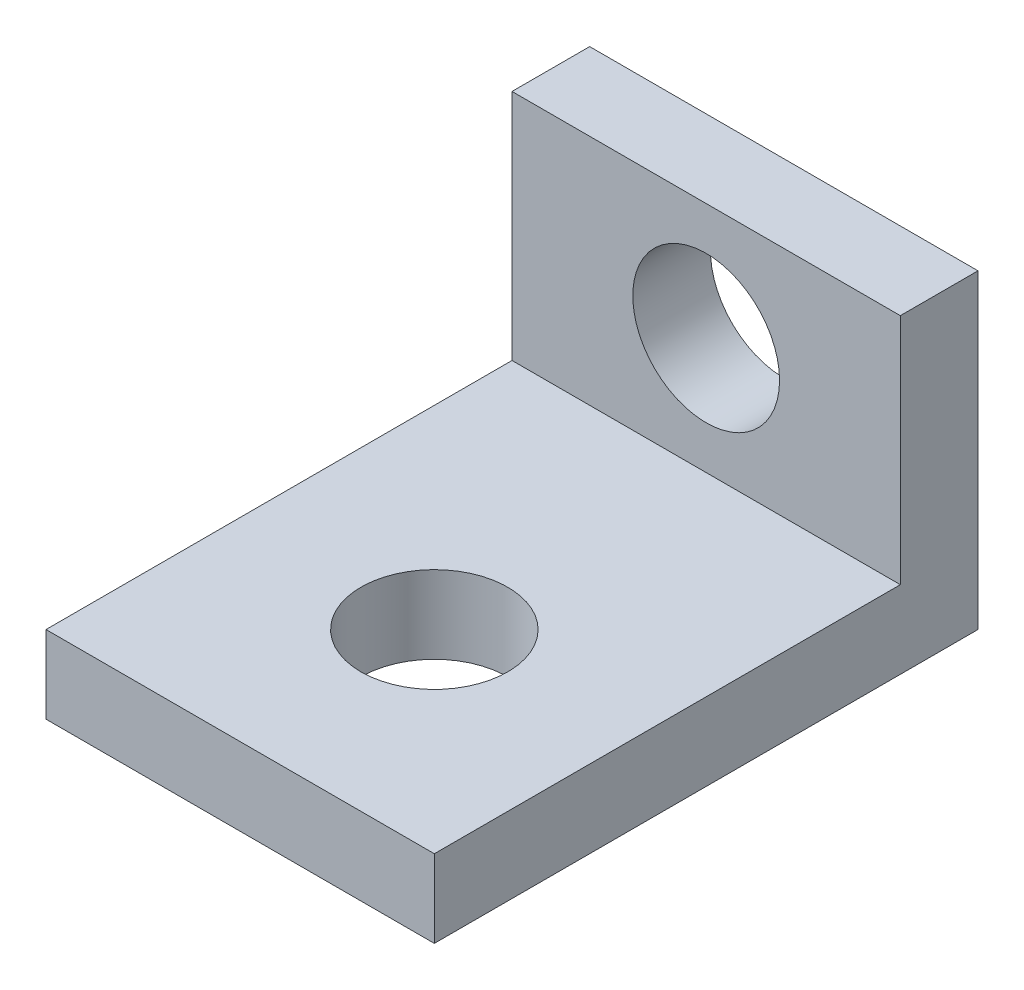
ISO-10303-21;
HEADER;
FILE_DESCRIPTION(('STEP AP214'),'2;1');
FILE_NAME('part.step','',(''),(''),'','','');
FILE_SCHEMA(('AUTOMOTIVE_DESIGN { 1 0 10303 214 1 1 1 1 }'));
ENDSEC;
DATA;
#1=APPLICATION_CONTEXT('core data for automotive mechanical design processes');
#2=APPLICATION_PROTOCOL_DEFINITION('international standard','automotive_design',2000,#1);
#3=PRODUCT_CONTEXT('',#1,'mechanical');
#4=PRODUCT('Part','Part','',(#3));
#5=PRODUCT_RELATED_PRODUCT_CATEGORY('part','',(#4));
#6=PRODUCT_DEFINITION_FORMATION('','',#4);
#7=PRODUCT_DEFINITION_CONTEXT('part definition',#1,'design');
#8=PRODUCT_DEFINITION('design','',#6,#7);
#9=PRODUCT_DEFINITION_SHAPE('','',#8);
#10=(LENGTH_UNIT() NAMED_UNIT(*) SI_UNIT(.MILLI.,.METRE.));
#11=(NAMED_UNIT(*) PLANE_ANGLE_UNIT() SI_UNIT($,.RADIAN.));
#12=(NAMED_UNIT(*) SI_UNIT($,.STERADIAN.) SOLID_ANGLE_UNIT());
#13=UNCERTAINTY_MEASURE_WITH_UNIT(LENGTH_MEASURE(1.E-05),#10,'distance_accuracy_value','');
#14=(GEOMETRIC_REPRESENTATION_CONTEXT(3) GLOBAL_UNCERTAINTY_ASSIGNED_CONTEXT((#13)) GLOBAL_UNIT_ASSIGNED_CONTEXT((#10,
#11,#12)) REPRESENTATION_CONTEXT('',''));
#15=CARTESIAN_POINT('',(0.,0.,0.));
#16=DIRECTION('',(0.,0.,1.));
#17=DIRECTION('',(1.,0.,0.));
#18=AXIS2_PLACEMENT_3D('',#15,#16,#17);
#19=CARTESIAN_POINT('',(-10.776307345283,2.54,0.));
#20=DIRECTION('',(0.,-1.,0.));
#21=DIRECTION('',(0.,0.,-1.));
#22=AXIS2_PLACEMENT_3D('',#19,#20,#21);
#23=PLANE('',#22);
#24=DIRECTION('',(-1.,0.,0.));
#25=VECTOR('',#24,1.);
#26=CARTESIAN_POINT('',(0.,2.54,7.62));
#27=LINE('',#26,#25);
#28=CARTESIAN_POINT('',(12.7,2.54,7.62));
#29=VERTEX_POINT('',#28);
#30=CARTESIAN_POINT('',(0.,2.54,7.62));
#31=VERTEX_POINT('',#30);
#32=EDGE_CURVE('E104',#29,#31,#27,.T.);
#33=ORIENTED_EDGE('',*,*,#32,.F.);
#34=DIRECTION('',(0.,0.,-1.));
#35=VECTOR('',#34,1.);
#36=CARTESIAN_POINT('',(12.7,2.54,0.));
#37=LINE('',#36,#35);
#38=CARTESIAN_POINT('',(12.7,2.54,-7.62));
#39=VERTEX_POINT('',#38);
#40=EDGE_CURVE('E48',#29,#39,#37,.T.);
#41=ORIENTED_EDGE('',*,*,#40,.T.);
#42=DIRECTION('',(1.,0.,0.));
#43=VECTOR('',#42,1.);
#44=CARTESIAN_POINT('',(-10.776307345283,2.54,-7.62));
#45=LINE('',#44,#43);
#46=CARTESIAN_POINT('',(0.,2.54,-7.62));
#47=VERTEX_POINT('',#46);
#48=EDGE_CURVE('E120',#47,#39,#45,.T.);
#49=ORIENTED_EDGE('',*,*,#48,.F.);
#50=DIRECTION('',(0.,0.,-1.));
#51=VECTOR('',#50,1.);
#52=CARTESIAN_POINT('',(0.,2.54,0.));
#53=LINE('',#52,#51);
#54=EDGE_CURVE('E117',#31,#47,#53,.T.);
#55=ORIENTED_EDGE('',*,*,#54,.F.);
#56=EDGE_LOOP('',(#33,#41,#49,#55));
#57=FACE_BOUND('',#56,.T.);
#58=CARTESIAN_POINT('',(6.35,2.54,1.27));
#59=DIRECTION('',(0.,1.,0.));
#60=DIRECTION('',(0.,0.,1.));
#61=AXIS2_PLACEMENT_3D('',#58,#59,#60);
#62=CIRCLE('',#61,2.39999999999999);
#63=CARTESIAN_POINT('',(6.35,2.54,3.66999999999999));
#64=VERTEX_POINT('',#63);
#65=EDGE_CURVE('E149',#64,#64,#62,.T.);
#66=ORIENTED_EDGE('',*,*,#65,.F.);
#67=EDGE_LOOP('',(#66));
#68=FACE_BOUND('',#67,.T.);
#69=ADVANCED_FACE('F33',(#57,#68),#23,.F.);
#70=CARTESIAN_POINT('',(-10.776307345283,10.16,-7.62));
#71=DIRECTION('',(0.,0.,-1.));
#72=DIRECTION('',(-1.,0.,0.));
#73=AXIS2_PLACEMENT_3D('',#70,#71,#72);
#74=PLANE('',#73);
#75=ORIENTED_EDGE('',*,*,#48,.T.);
#76=DIRECTION('',(0.,1.,0.));
#77=VECTOR('',#76,1.);
#78=CARTESIAN_POINT('',(12.7,10.16,-7.62));
#79=LINE('',#78,#77);
#80=CARTESIAN_POINT('',(12.7,10.16,-7.62));
#81=VERTEX_POINT('',#80);
#82=EDGE_CURVE('E150',#39,#81,#79,.T.);
#83=ORIENTED_EDGE('',*,*,#82,.T.);
#84=DIRECTION('',(1.,0.,0.));
#85=VECTOR('',#84,1.);
#86=CARTESIAN_POINT('',(-10.776307345283,10.16,-7.62));
#87=LINE('',#86,#85);
#88=CARTESIAN_POINT('',(0.,10.16,-7.62));
#89=VERTEX_POINT('',#88);
#90=EDGE_CURVE('E56',#89,#81,#87,.T.);
#91=ORIENTED_EDGE('',*,*,#90,.F.);
#92=DIRECTION('',(0.,1.,0.));
#93=VECTOR('',#92,1.);
#94=CARTESIAN_POINT('',(0.,10.16,-7.62));
#95=LINE('',#94,#93);
#96=EDGE_CURVE('E121',#47,#89,#95,.T.);
#97=ORIENTED_EDGE('',*,*,#96,.F.);
#98=EDGE_LOOP('',(#75,#83,#91,#97));
#99=FACE_BOUND('',#98,.T.);
#100=CARTESIAN_POINT('',(6.35,6.35,-7.62));
#101=DIRECTION('',(0.,0.,1.));
#102=DIRECTION('',(1.,0.,0.));
#103=AXIS2_PLACEMENT_3D('',#100,#101,#102);
#104=CIRCLE('',#103,2.39999999999999);
#105=CARTESIAN_POINT('',(8.74999999999999,6.35,-7.62));
#106=VERTEX_POINT('',#105);
#107=EDGE_CURVE('E106',#106,#106,#104,.T.);
#108=ORIENTED_EDGE('',*,*,#107,.F.);
#109=EDGE_LOOP('',(#108));
#110=FACE_BOUND('',#109,.T.);
#111=ADVANCED_FACE('F145',(#99,#110),#74,.F.);
#112=CARTESIAN_POINT('',(38.1,0.,0.));
#113=DIRECTION('',(0.,1.,0.));
#114=DIRECTION('',(0.,0.,1.));
#115=AXIS2_PLACEMENT_3D('',#112,#113,#114);
#116=PLANE('',#115);
#117=CARTESIAN_POINT('',(6.35,0.,1.27));
#118=DIRECTION('',(0.,1.,0.));
#119=DIRECTION('',(0.,0.,1.));
#120=AXIS2_PLACEMENT_3D('',#117,#118,#119);
#121=CIRCLE('',#120,2.4);
#122=CARTESIAN_POINT('',(6.35,0.,3.67));
#123=VERTEX_POINT('',#122);
#124=EDGE_CURVE('E108',#123,#123,#121,.T.);
#125=ORIENTED_EDGE('',*,*,#124,.T.);
#126=EDGE_LOOP('',(#125));
#127=FACE_BOUND('',#126,.T.);
#128=DIRECTION('',(-1.,0.,0.));
#129=VECTOR('',#128,1.);
#130=CARTESIAN_POINT('',(38.1,0.,-10.16));
#131=LINE('',#130,#129);
#132=CARTESIAN_POINT('',(12.7,0.,-10.16));
#133=VERTEX_POINT('',#132);
#134=CARTESIAN_POINT('',(0.,0.,-10.16));
#135=VERTEX_POINT('',#134);
#136=EDGE_CURVE('E11',#133,#135,#131,.T.);
#137=ORIENTED_EDGE('',*,*,#136,.F.);
#138=DIRECTION('',(0.,0.,-1.));
#139=VECTOR('',#138,1.);
#140=CARTESIAN_POINT('',(12.7,0.,34.9766372202433));
#141=LINE('',#140,#139);
#142=CARTESIAN_POINT('',(12.7,0.,7.62));
#143=VERTEX_POINT('',#142);
#144=EDGE_CURVE('E86',#143,#133,#141,.T.);
#145=ORIENTED_EDGE('',*,*,#144,.F.);
#146=DIRECTION('',(1.,0.,0.));
#147=VECTOR('',#146,1.);
#148=CARTESIAN_POINT('',(0.,0.,7.62));
#149=LINE('',#148,#147);
#150=CARTESIAN_POINT('',(0.,0.,7.62));
#151=VERTEX_POINT('',#150);
#152=EDGE_CURVE('E97',#151,#143,#149,.T.);
#153=ORIENTED_EDGE('',*,*,#152,.F.);
#154=DIRECTION('',(0.,0.,-1.));
#155=VECTOR('',#154,1.);
#156=CARTESIAN_POINT('',(0.,0.,0.));
#157=LINE('',#156,#155);
#158=EDGE_CURVE('E124',#151,#135,#157,.T.);
#159=ORIENTED_EDGE('',*,*,#158,.T.);
#160=EDGE_LOOP('',(#137,#145,#153,#159));
#161=FACE_BOUND('',#160,.T.);
#162=ADVANCED_FACE('F35',(#127,#161),#116,.F.);
#163=CARTESIAN_POINT('',(38.1,0.,-10.16));
#164=DIRECTION('',(0.,0.,1.));
#165=DIRECTION('',(1.,0.,0.));
#166=AXIS2_PLACEMENT_3D('',#163,#164,#165);
#167=PLANE('',#166);
#168=CARTESIAN_POINT('',(6.35,6.35,-10.16));
#169=DIRECTION('',(0.,0.,1.));
#170=DIRECTION('',(1.,0.,0.));
#171=AXIS2_PLACEMENT_3D('',#168,#169,#170);
#172=CIRCLE('',#171,2.4);
#173=CARTESIAN_POINT('',(8.75,6.35,-10.16));
#174=VERTEX_POINT('',#173);
#175=EDGE_CURVE('E114',#174,#174,#172,.T.);
#176=ORIENTED_EDGE('',*,*,#175,.T.);
#177=EDGE_LOOP('',(#176));
#178=FACE_BOUND('',#177,.T.);
#179=DIRECTION('',(-1.,0.,0.));
#180=VECTOR('',#179,1.);
#181=CARTESIAN_POINT('',(38.1,10.16,-10.16));
#182=LINE('',#181,#180);
#183=CARTESIAN_POINT('',(12.7,10.16,-10.16));
#184=VERTEX_POINT('',#183);
#185=CARTESIAN_POINT('',(0.,10.16,-10.16));
#186=VERTEX_POINT('',#185);
#187=EDGE_CURVE('E41',#184,#186,#182,.T.);
#188=ORIENTED_EDGE('',*,*,#187,.F.);
#189=DIRECTION('',(0.,1.,0.));
#190=VECTOR('',#189,1.);
#191=CARTESIAN_POINT('',(12.7,10.16,-10.16));
#192=LINE('',#191,#190);
#193=EDGE_CURVE('E99',#133,#184,#192,.T.);
#194=ORIENTED_EDGE('',*,*,#193,.F.);
#195=ORIENTED_EDGE('',*,*,#136,.T.);
#196=DIRECTION('',(0.,1.,0.));
#197=VECTOR('',#196,1.);
#198=CARTESIAN_POINT('',(0.,0.,-10.16));
#199=LINE('',#198,#197);
#200=EDGE_CURVE('E128',#135,#186,#199,.T.);
#201=ORIENTED_EDGE('',*,*,#200,.T.);
#202=EDGE_LOOP('',(#188,#194,#195,#201));
#203=FACE_BOUND('',#202,.T.);
#204=ADVANCED_FACE('F140',(#178,#203),#167,.F.);
#205=CARTESIAN_POINT('',(38.1,10.16,0.));
#206=DIRECTION('',(0.,-1.,0.));
#207=DIRECTION('',(0.,0.,-1.));
#208=AXIS2_PLACEMENT_3D('',#205,#206,#207);
#209=PLANE('',#208);
#210=ORIENTED_EDGE('',*,*,#90,.T.);
#211=DIRECTION('',(0.,0.,-1.));
#212=VECTOR('',#211,1.);
#213=CARTESIAN_POINT('',(12.7,10.16,34.9766372202433));
#214=LINE('',#213,#212);
#215=EDGE_CURVE('E91',#81,#184,#214,.T.);
#216=ORIENTED_EDGE('',*,*,#215,.T.);
#217=ORIENTED_EDGE('',*,*,#187,.T.);
#218=DIRECTION('',(0.,0.,1.));
#219=VECTOR('',#218,1.);
#220=CARTESIAN_POINT('',(0.,10.16,0.));
#221=LINE('',#220,#219);
#222=EDGE_CURVE('E131',#186,#89,#221,.T.);
#223=ORIENTED_EDGE('',*,*,#222,.T.);
#224=EDGE_LOOP('',(#210,#216,#217,#223));
#225=FACE_BOUND('',#224,.T.);
#226=ADVANCED_FACE('F136',(#225),#209,.F.);
#227=CARTESIAN_POINT('',(0.,0.,0.));
#228=DIRECTION('',(-1.,0.,0.));
#229=DIRECTION('',(0.,0.,1.));
#230=AXIS2_PLACEMENT_3D('',#227,#228,#229);
#231=PLANE('',#230);
#232=ORIENTED_EDGE('',*,*,#54,.T.);
#233=ORIENTED_EDGE('',*,*,#96,.T.);
#234=ORIENTED_EDGE('',*,*,#222,.F.);
#235=ORIENTED_EDGE('',*,*,#200,.F.);
#236=ORIENTED_EDGE('',*,*,#158,.F.);
#237=DIRECTION('',(0.,-1.,0.));
#238=VECTOR('',#237,1.);
#239=CARTESIAN_POINT('',(0.,2.54,7.62));
#240=LINE('',#239,#238);
#241=EDGE_CURVE('E103',#31,#151,#240,.T.);
#242=ORIENTED_EDGE('',*,*,#241,.F.);
#243=EDGE_LOOP('',(#232,#233,#234,#235,#236,#242));
#244=FACE_BOUND('',#243,.T.);
#245=ADVANCED_FACE('F142',(#244),#231,.T.);
#246=CARTESIAN_POINT('',(6.35,6.35,-7.62));
#247=DIRECTION('',(0.,0.,1.));
#248=DIRECTION('',(1.,0.,0.));
#249=AXIS2_PLACEMENT_3D('',#246,#247,#248);
#250=CYLINDRICAL_SURFACE('',#249,2.39999999999999);
#251=ORIENTED_EDGE('',*,*,#175,.F.);
#252=EDGE_LOOP('',(#251));
#253=FACE_BOUND('',#252,.T.);
#254=ORIENTED_EDGE('',*,*,#107,.T.);
#255=EDGE_LOOP('',(#254));
#256=FACE_BOUND('',#255,.T.);
#257=ADVANCED_FACE('F176',(#253,#256),#250,.F.);
#258=CARTESIAN_POINT('',(0.,0.,7.62));
#259=DIRECTION('',(0.,0.,1.));
#260=DIRECTION('',(1.,0.,0.));
#261=AXIS2_PLACEMENT_3D('',#258,#259,#260);
#262=PLANE('',#261);
#263=DIRECTION('',(0.,1.,0.));
#264=VECTOR('',#263,1.);
#265=CARTESIAN_POINT('',(12.7,10.16,7.62));
#266=LINE('',#265,#264);
#267=EDGE_CURVE('E83',#143,#29,#266,.T.);
#268=ORIENTED_EDGE('',*,*,#267,.T.);
#269=ORIENTED_EDGE('',*,*,#32,.T.);
#270=ORIENTED_EDGE('',*,*,#241,.T.);
#271=ORIENTED_EDGE('',*,*,#152,.T.);
#272=EDGE_LOOP('',(#268,#269,#270,#271));
#273=FACE_BOUND('',#272,.T.);
#274=ADVANCED_FACE('F101',(#273),#262,.T.);
#275=CARTESIAN_POINT('',(6.35,2.54,1.27));
#276=DIRECTION('',(0.,1.,0.));
#277=DIRECTION('',(0.,0.,1.));
#278=AXIS2_PLACEMENT_3D('',#275,#276,#277);
#279=CYLINDRICAL_SURFACE('',#278,2.39999999999999);
#280=ORIENTED_EDGE('',*,*,#124,.F.);
#281=EDGE_LOOP('',(#280));
#282=FACE_BOUND('',#281,.T.);
#283=ORIENTED_EDGE('',*,*,#65,.T.);
#284=EDGE_LOOP('',(#283));
#285=FACE_BOUND('',#284,.T.);
#286=ADVANCED_FACE('F159',(#282,#285),#279,.F.);
#287=CARTESIAN_POINT('',(12.7,10.16,34.9766372202433));
#288=DIRECTION('',(-1.,0.,0.));
#289=DIRECTION('',(0.,0.,1.));
#290=AXIS2_PLACEMENT_3D('',#287,#288,#289);
#291=PLANE('',#290);
#292=ORIENTED_EDGE('',*,*,#267,.F.);
#293=ORIENTED_EDGE('',*,*,#144,.T.);
#294=ORIENTED_EDGE('',*,*,#193,.T.);
#295=ORIENTED_EDGE('',*,*,#215,.F.);
#296=ORIENTED_EDGE('',*,*,#82,.F.);
#297=ORIENTED_EDGE('',*,*,#40,.F.);
#298=EDGE_LOOP('',(#292,#293,#294,#295,#296,#297));
#299=FACE_BOUND('',#298,.T.);
#300=ADVANCED_FACE('F85',(#299),#291,.F.);
#301=CLOSED_SHELL('',(#69,#111,#162,#204,#226,#245,#257,#274,#286,#300));
#302=MANIFOLD_SOLID_BREP('B2',#301);
#303=ADVANCED_BREP_SHAPE_REPRESENTATION('',(#18,#302),#14);
#304=SHAPE_DEFINITION_REPRESENTATION(#9,#303);
ENDSEC;
END-ISO-10303-21;
